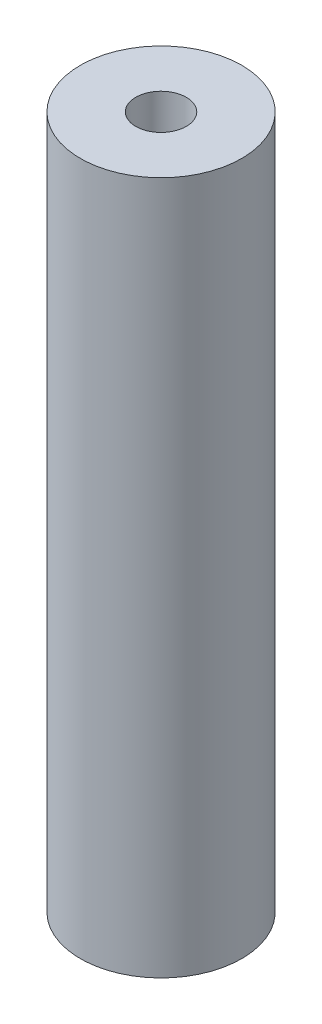
ISO-10303-21;
HEADER;
FILE_DESCRIPTION(('STEP AP214'),'2;1');
FILE_NAME('part.step','',(''),(''),'','','');
FILE_SCHEMA(('AUTOMOTIVE_DESIGN { 1 0 10303 214 1 1 1 1 }'));
ENDSEC;
DATA;
#1=APPLICATION_CONTEXT('core data for automotive mechanical design processes');
#2=APPLICATION_PROTOCOL_DEFINITION('international standard','automotive_design',2000,#1);
#3=PRODUCT_CONTEXT('',#1,'mechanical');
#4=PRODUCT('Part','Part','',(#3));
#5=PRODUCT_RELATED_PRODUCT_CATEGORY('part','',(#4));
#6=PRODUCT_DEFINITION_FORMATION('','',#4);
#7=PRODUCT_DEFINITION_CONTEXT('part definition',#1,'design');
#8=PRODUCT_DEFINITION('design','',#6,#7);
#9=PRODUCT_DEFINITION_SHAPE('','',#8);
#10=(LENGTH_UNIT() NAMED_UNIT(*) SI_UNIT(.MILLI.,.METRE.));
#11=(NAMED_UNIT(*) PLANE_ANGLE_UNIT() SI_UNIT($,.RADIAN.));
#12=(NAMED_UNIT(*) SI_UNIT($,.STERADIAN.) SOLID_ANGLE_UNIT());
#13=UNCERTAINTY_MEASURE_WITH_UNIT(LENGTH_MEASURE(1.E-05),#10,'distance_accuracy_value','');
#14=(GEOMETRIC_REPRESENTATION_CONTEXT(3) GLOBAL_UNCERTAINTY_ASSIGNED_CONTEXT((#13)) GLOBAL_UNIT_ASSIGNED_CONTEXT((#10,
#11,#12)) REPRESENTATION_CONTEXT('',''));
#15=CARTESIAN_POINT('',(0.,0.,0.));
#16=DIRECTION('',(0.,0.,1.));
#17=DIRECTION('',(1.,0.,0.));
#18=AXIS2_PLACEMENT_3D('',#15,#16,#17);
#19=CARTESIAN_POINT('',(0.,42.5,0.));
#20=DIRECTION('',(0.,1.,0.));
#21=DIRECTION('',(0.,0.,1.));
#22=AXIS2_PLACEMENT_3D('',#19,#20,#21);
#23=PLANE('',#22);
#24=CARTESIAN_POINT('',(0.,42.5,0.));
#25=DIRECTION('',(0.,1.,0.));
#26=DIRECTION('',(0.,0.,1.));
#27=AXIS2_PLACEMENT_3D('',#24,#25,#26);
#28=CIRCLE('',#27,1.55);
#29=CARTESIAN_POINT('',(0.,42.5,1.55));
#30=VERTEX_POINT('',#29);
#31=EDGE_CURVE('E10',#30,#30,#28,.T.);
#32=ORIENTED_EDGE('',*,*,#31,.F.);
#33=EDGE_LOOP('',(#32));
#34=FACE_BOUND('',#33,.T.);
#35=CARTESIAN_POINT('',(0.,42.5,0.));
#36=DIRECTION('',(0.,-1.,0.));
#37=DIRECTION('',(0.,0.,-1.));
#38=AXIS2_PLACEMENT_3D('',#35,#36,#37);
#39=CIRCLE('',#38,4.95);
#40=CARTESIAN_POINT('',(0.,42.5,-4.95));
#41=VERTEX_POINT('',#40);
#42=EDGE_CURVE('E56',#41,#41,#39,.T.);
#43=ORIENTED_EDGE('',*,*,#42,.F.);
#44=EDGE_LOOP('',(#43));
#45=FACE_BOUND('',#44,.T.);
#46=ADVANCED_FACE('F43',(#34,#45),#23,.T.);
#47=CARTESIAN_POINT('',(0.,0.,0.));
#48=DIRECTION('',(0.,1.,0.));
#49=DIRECTION('',(0.,0.,1.));
#50=AXIS2_PLACEMENT_3D('',#47,#48,#49);
#51=PLANE('',#50);
#52=CARTESIAN_POINT('',(0.,0.,0.));
#53=DIRECTION('',(0.,1.,0.));
#54=DIRECTION('',(0.,0.,1.));
#55=AXIS2_PLACEMENT_3D('',#52,#53,#54);
#56=CIRCLE('',#55,1.55);
#57=CARTESIAN_POINT('',(0.,0.,1.55));
#58=VERTEX_POINT('',#57);
#59=EDGE_CURVE('E47',#58,#58,#56,.T.);
#60=ORIENTED_EDGE('',*,*,#59,.T.);
#61=EDGE_LOOP('',(#60));
#62=FACE_BOUND('',#61,.T.);
#63=CARTESIAN_POINT('',(0.,0.,0.));
#64=DIRECTION('',(0.,-1.,0.));
#65=DIRECTION('',(0.,0.,-1.));
#66=AXIS2_PLACEMENT_3D('',#63,#64,#65);
#67=CIRCLE('',#66,4.95);
#68=CARTESIAN_POINT('',(0.,0.,-4.95));
#69=VERTEX_POINT('',#68);
#70=EDGE_CURVE('E58',#69,#69,#67,.T.);
#71=ORIENTED_EDGE('',*,*,#70,.T.);
#72=EDGE_LOOP('',(#71));
#73=FACE_BOUND('',#72,.T.);
#74=ADVANCED_FACE('F45',(#62,#73),#51,.F.);
#75=CARTESIAN_POINT('',(0.,42.5,0.));
#76=DIRECTION('',(0.,-1.,0.));
#77=DIRECTION('',(0.,0.,-1.));
#78=AXIS2_PLACEMENT_3D('',#75,#76,#77);
#79=CYLINDRICAL_SURFACE('',#78,1.55);
#80=ORIENTED_EDGE('',*,*,#31,.T.);
#81=EDGE_LOOP('',(#80));
#82=FACE_BOUND('',#81,.T.);
#83=ORIENTED_EDGE('',*,*,#59,.F.);
#84=EDGE_LOOP('',(#83));
#85=FACE_BOUND('',#84,.T.);
#86=ADVANCED_FACE('F75',(#82,#85),#79,.F.);
#87=CARTESIAN_POINT('',(0.,42.5,0.));
#88=DIRECTION('',(0.,-1.,0.));
#89=DIRECTION('',(0.,0.,-1.));
#90=AXIS2_PLACEMENT_3D('',#87,#88,#89);
#91=CYLINDRICAL_SURFACE('',#90,4.95);
#92=ORIENTED_EDGE('',*,*,#42,.T.);
#93=EDGE_LOOP('',(#92));
#94=FACE_BOUND('',#93,.T.);
#95=ORIENTED_EDGE('',*,*,#70,.F.);
#96=EDGE_LOOP('',(#95));
#97=FACE_BOUND('',#96,.T.);
#98=ADVANCED_FACE('F66',(#94,#97),#91,.T.);
#99=CLOSED_SHELL('',(#46,#74,#86,#98));
#100=MANIFOLD_SOLID_BREP('B2',#99);
#101=ADVANCED_BREP_SHAPE_REPRESENTATION('',(#18,#100),#14);
#102=SHAPE_DEFINITION_REPRESENTATION(#9,#101);
ENDSEC;
END-ISO-10303-21;
